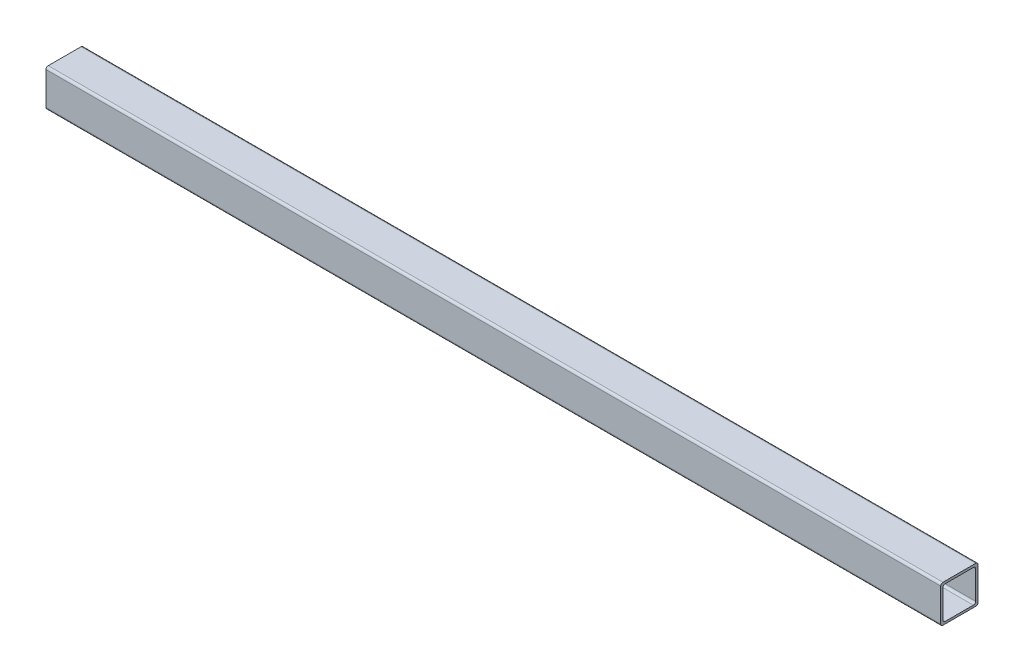
ISO-10303-21;
HEADER;
FILE_DESCRIPTION(('STEP AP214'),'2;1');
FILE_NAME('part.step','',(''),(''),'','','');
FILE_SCHEMA(('AUTOMOTIVE_DESIGN { 1 0 10303 214 1 1 1 1 }'));
ENDSEC;
DATA;
#1=APPLICATION_CONTEXT('core data for automotive mechanical design processes');
#2=APPLICATION_PROTOCOL_DEFINITION('international standard','automotive_design',2000,#1);
#3=PRODUCT_CONTEXT('',#1,'mechanical');
#4=PRODUCT('Part','Part','',(#3));
#5=PRODUCT_RELATED_PRODUCT_CATEGORY('part','',(#4));
#6=PRODUCT_DEFINITION_FORMATION('','',#4);
#7=PRODUCT_DEFINITION_CONTEXT('part definition',#1,'design');
#8=PRODUCT_DEFINITION('design','',#6,#7);
#9=PRODUCT_DEFINITION_SHAPE('','',#8);
#10=(LENGTH_UNIT() NAMED_UNIT(*) SI_UNIT(.MILLI.,.METRE.));
#11=(NAMED_UNIT(*) PLANE_ANGLE_UNIT() SI_UNIT($,.RADIAN.));
#12=(NAMED_UNIT(*) SI_UNIT($,.STERADIAN.) SOLID_ANGLE_UNIT());
#13=UNCERTAINTY_MEASURE_WITH_UNIT(LENGTH_MEASURE(1.E-05),#10,'distance_accuracy_value','');
#14=(GEOMETRIC_REPRESENTATION_CONTEXT(3) GLOBAL_UNCERTAINTY_ASSIGNED_CONTEXT((#13)) GLOBAL_UNIT_ASSIGNED_CONTEXT((#10,
#11,#12)) REPRESENTATION_CONTEXT('',''));
#15=CARTESIAN_POINT('',(0.,0.,0.));
#16=DIRECTION('',(0.,0.,1.));
#17=DIRECTION('',(1.,0.,0.));
#18=AXIS2_PLACEMENT_3D('',#15,#16,#17);
#19=CARTESIAN_POINT('',(304.8,11.938,-11.938));
#20=DIRECTION('',(-1.,0.,0.));
#21=DIRECTION('',(0.,0.,1.));
#22=AXIS2_PLACEMENT_3D('',#19,#20,#21);
#23=PLANE('',#22);
#24=CARTESIAN_POINT('',(304.8,11.938,-11.938));
#25=DIRECTION('',(1.,0.,0.));
#26=DIRECTION('',(0.,0.,1.));
#27=AXIS2_PLACEMENT_3D('',#24,#25,#26);
#28=CIRCLE('',#27,0.762000000000001);
#29=CARTESIAN_POINT('',(304.8,11.938,-12.7));
#30=VERTEX_POINT('',#29);
#31=CARTESIAN_POINT('',(304.8,12.7,-11.938));
#32=VERTEX_POINT('',#31);
#33=EDGE_CURVE('E242',#30,#32,#28,.T.);
#34=ORIENTED_EDGE('',*,*,#33,.T.);
#35=DIRECTION('',(0.,0.,1.));
#36=VECTOR('',#35,1.);
#37=CARTESIAN_POINT('',(304.8,12.7,-0.762000000000002));
#38=LINE('',#37,#36);
#39=CARTESIAN_POINT('',(304.8,12.7,-0.762000000000002));
#40=VERTEX_POINT('',#39);
#41=EDGE_CURVE('E246',#32,#40,#38,.T.);
#42=ORIENTED_EDGE('',*,*,#41,.T.);
#43=CARTESIAN_POINT('',(304.8,11.938,-0.761999999999997));
#44=DIRECTION('',(1.,0.,0.));
#45=DIRECTION('',(0.,0.,1.));
#46=AXIS2_PLACEMENT_3D('',#43,#44,#45);
#47=CIRCLE('',#46,0.762);
#48=CARTESIAN_POINT('',(304.8,11.938,0.));
#49=VERTEX_POINT('',#48);
#50=EDGE_CURVE('E250',#40,#49,#47,.T.);
#51=ORIENTED_EDGE('',*,*,#50,.T.);
#52=DIRECTION('',(0.,-1.,0.));
#53=VECTOR('',#52,1.);
#54=CARTESIAN_POINT('',(304.8,0.762000000000005,0.));
#55=LINE('',#54,#53);
#56=CARTESIAN_POINT('',(304.8,0.762000000000005,0.));
#57=VERTEX_POINT('',#56);
#58=EDGE_CURVE('E253',#49,#57,#55,.T.);
#59=ORIENTED_EDGE('',*,*,#58,.T.);
#60=CARTESIAN_POINT('',(304.8,0.762,-0.762));
#61=DIRECTION('',(1.,0.,0.));
#62=DIRECTION('',(0.,0.,1.));
#63=AXIS2_PLACEMENT_3D('',#60,#61,#62);
#64=CIRCLE('',#63,0.762);
#65=CARTESIAN_POINT('',(304.8,0.,-0.762000000000005));
#66=VERTEX_POINT('',#65);
#67=EDGE_CURVE('E256',#57,#66,#64,.T.);
#68=ORIENTED_EDGE('',*,*,#67,.T.);
#69=DIRECTION('',(0.,0.,-1.));
#70=VECTOR('',#69,1.);
#71=CARTESIAN_POINT('',(304.8,0.,-0.762000000000005));
#72=LINE('',#71,#70);
#73=CARTESIAN_POINT('',(304.8,0.,-11.938));
#74=VERTEX_POINT('',#73);
#75=EDGE_CURVE('E259',#66,#74,#72,.T.);
#76=ORIENTED_EDGE('',*,*,#75,.T.);
#77=CARTESIAN_POINT('',(304.8,0.762,-11.938));
#78=DIRECTION('',(1.,0.,0.));
#79=DIRECTION('',(0.,0.,-1.));
#80=AXIS2_PLACEMENT_3D('',#77,#78,#79);
#81=CIRCLE('',#80,0.762);
#82=CARTESIAN_POINT('',(304.8,0.762,-12.7));
#83=VERTEX_POINT('',#82);
#84=EDGE_CURVE('E262',#74,#83,#81,.T.);
#85=ORIENTED_EDGE('',*,*,#84,.T.);
#86=DIRECTION('',(0.,1.,0.));
#87=VECTOR('',#86,1.);
#88=CARTESIAN_POINT('',(304.8,0.762000000000005,-12.7));
#89=LINE('',#88,#87);
#90=EDGE_CURVE('E265',#83,#30,#89,.T.);
#91=ORIENTED_EDGE('',*,*,#90,.T.);
#92=EDGE_LOOP('',(#34,#42,#51,#59,#68,#76,#85,#91));
#93=FACE_BOUND('',#92,.T.);
#94=CARTESIAN_POINT('',(304.8,11.1125,-11.1125));
#95=DIRECTION('',(1.,0.,0.));
#96=DIRECTION('',(0.,0.,1.));
#97=AXIS2_PLACEMENT_3D('',#94,#95,#96);
#98=CIRCLE('',#97,0.762000000000001);
#99=CARTESIAN_POINT('',(304.8,11.1125,-11.8745));
#100=VERTEX_POINT('',#99);
#101=CARTESIAN_POINT('',(304.8,11.8745,-11.1125));
#102=VERTEX_POINT('',#101);
#103=EDGE_CURVE('E153',#100,#102,#98,.T.);
#104=ORIENTED_EDGE('',*,*,#103,.F.);
#105=DIRECTION('',(0.,1.,0.));
#106=VECTOR('',#105,1.);
#107=CARTESIAN_POINT('',(304.8,1.52400000000001,-11.8745));
#108=LINE('',#107,#106);
#109=CARTESIAN_POINT('',(304.8,1.524,-11.8745));
#110=VERTEX_POINT('',#109);
#111=EDGE_CURVE('E194',#110,#100,#108,.T.);
#112=ORIENTED_EDGE('',*,*,#111,.F.);
#113=CARTESIAN_POINT('',(304.8,1.524,-11.1125));
#114=DIRECTION('',(1.,0.,0.));
#115=DIRECTION('',(0.,0.,-1.));
#116=AXIS2_PLACEMENT_3D('',#113,#114,#115);
#117=CIRCLE('',#116,0.762);
#118=CARTESIAN_POINT('',(304.8,0.762,-11.1125));
#119=VERTEX_POINT('',#118);
#120=EDGE_CURVE('E191',#119,#110,#117,.T.);
#121=ORIENTED_EDGE('',*,*,#120,.F.);
#122=DIRECTION('',(0.,0.,-1.));
#123=VECTOR('',#122,1.);
#124=CARTESIAN_POINT('',(304.8,0.762,-1.52400000000001));
#125=LINE('',#124,#123);
#126=CARTESIAN_POINT('',(304.8,0.762,-1.52400000000001));
#127=VERTEX_POINT('',#126);
#128=EDGE_CURVE('E188',#127,#119,#125,.T.);
#129=ORIENTED_EDGE('',*,*,#128,.F.);
#130=CARTESIAN_POINT('',(304.8,1.524,-1.524));
#131=DIRECTION('',(1.,0.,0.));
#132=DIRECTION('',(0.,0.,1.));
#133=AXIS2_PLACEMENT_3D('',#130,#131,#132);
#134=CIRCLE('',#133,0.762);
#135=CARTESIAN_POINT('',(304.8,1.52400000000001,-0.762));
#136=VERTEX_POINT('',#135);
#137=EDGE_CURVE('E185',#136,#127,#134,.T.);
#138=ORIENTED_EDGE('',*,*,#137,.F.);
#139=DIRECTION('',(0.,-1.,0.));
#140=VECTOR('',#139,1.);
#141=CARTESIAN_POINT('',(304.8,1.52400000000001,-0.762));
#142=LINE('',#141,#140);
#143=CARTESIAN_POINT('',(304.8,11.1125,-0.762));
#144=VERTEX_POINT('',#143);
#145=EDGE_CURVE('E180',#144,#136,#142,.T.);
#146=ORIENTED_EDGE('',*,*,#145,.F.);
#147=CARTESIAN_POINT('',(304.8,11.1125,-1.524));
#148=DIRECTION('',(1.,0.,0.));
#149=DIRECTION('',(0.,0.,1.));
#150=AXIS2_PLACEMENT_3D('',#147,#148,#149);
#151=CIRCLE('',#150,0.762);
#152=CARTESIAN_POINT('',(304.8,11.8745,-1.52400000000001));
#153=VERTEX_POINT('',#152);
#154=EDGE_CURVE('E176',#153,#144,#151,.T.);
#155=ORIENTED_EDGE('',*,*,#154,.F.);
#156=DIRECTION('',(0.,0.,1.));
#157=VECTOR('',#156,1.);
#158=CARTESIAN_POINT('',(304.8,11.8745,-1.52400000000001));
#159=LINE('',#158,#157);
#160=EDGE_CURVE('E162',#102,#153,#159,.T.);
#161=ORIENTED_EDGE('',*,*,#160,.F.);
#162=EDGE_LOOP('',(#104,#112,#121,#129,#138,#146,#155,#161));
#163=FACE_BOUND('',#162,.T.);
#164=ADVANCED_FACE('F39',(#93,#163),#23,.F.);
#165=CARTESIAN_POINT('',(0.,11.938,-11.938));
#166=DIRECTION('',(-1.,0.,0.));
#167=DIRECTION('',(0.,0.,1.));
#168=AXIS2_PLACEMENT_3D('',#165,#166,#167);
#169=PLANE('',#168);
#170=CARTESIAN_POINT('',(0.,11.938,-11.938));
#171=DIRECTION('',(1.,0.,0.));
#172=DIRECTION('',(0.,0.,1.));
#173=AXIS2_PLACEMENT_3D('',#170,#171,#172);
#174=CIRCLE('',#173,0.762000000000001);
#175=CARTESIAN_POINT('',(0.,11.938,-12.7));
#176=VERTEX_POINT('',#175);
#177=CARTESIAN_POINT('',(0.,12.7,-11.938));
#178=VERTEX_POINT('',#177);
#179=EDGE_CURVE('E171',#176,#178,#174,.T.);
#180=ORIENTED_EDGE('',*,*,#179,.F.);
#181=DIRECTION('',(0.,1.,0.));
#182=VECTOR('',#181,1.);
#183=CARTESIAN_POINT('',(0.,0.762000000000005,-12.7));
#184=LINE('',#183,#182);
#185=CARTESIAN_POINT('',(0.,0.762,-12.7));
#186=VERTEX_POINT('',#185);
#187=EDGE_CURVE('E247',#186,#176,#184,.T.);
#188=ORIENTED_EDGE('',*,*,#187,.F.);
#189=CARTESIAN_POINT('',(0.,0.762,-11.938));
#190=DIRECTION('',(1.,0.,0.));
#191=DIRECTION('',(0.,0.,-1.));
#192=AXIS2_PLACEMENT_3D('',#189,#190,#191);
#193=CIRCLE('',#192,0.762);
#194=CARTESIAN_POINT('',(0.,0.,-11.938));
#195=VERTEX_POINT('',#194);
#196=EDGE_CURVE('E287',#195,#186,#193,.T.);
#197=ORIENTED_EDGE('',*,*,#196,.F.);
#198=DIRECTION('',(0.,0.,-1.));
#199=VECTOR('',#198,1.);
#200=CARTESIAN_POINT('',(0.,0.,-0.762000000000005));
#201=LINE('',#200,#199);
#202=CARTESIAN_POINT('',(0.,0.,-0.762000000000005));
#203=VERTEX_POINT('',#202);
#204=EDGE_CURVE('E284',#203,#195,#201,.T.);
#205=ORIENTED_EDGE('',*,*,#204,.F.);
#206=CARTESIAN_POINT('',(0.,0.762,-0.762));
#207=DIRECTION('',(1.,0.,0.));
#208=DIRECTION('',(0.,0.,1.));
#209=AXIS2_PLACEMENT_3D('',#206,#207,#208);
#210=CIRCLE('',#209,0.762);
#211=CARTESIAN_POINT('',(0.,0.762000000000005,0.));
#212=VERTEX_POINT('',#211);
#213=EDGE_CURVE('E281',#212,#203,#210,.T.);
#214=ORIENTED_EDGE('',*,*,#213,.F.);
#215=DIRECTION('',(0.,-1.,0.));
#216=VECTOR('',#215,1.);
#217=CARTESIAN_POINT('',(0.,0.762000000000005,0.));
#218=LINE('',#217,#216);
#219=CARTESIAN_POINT('',(0.,11.938,0.));
#220=VERTEX_POINT('',#219);
#221=EDGE_CURVE('E278',#220,#212,#218,.T.);
#222=ORIENTED_EDGE('',*,*,#221,.F.);
#223=CARTESIAN_POINT('',(0.,11.938,-0.761999999999997));
#224=DIRECTION('',(1.,0.,0.));
#225=DIRECTION('',(0.,0.,1.));
#226=AXIS2_PLACEMENT_3D('',#223,#224,#225);
#227=CIRCLE('',#226,0.762);
#228=CARTESIAN_POINT('',(0.,12.7,-0.762000000000002));
#229=VERTEX_POINT('',#228);
#230=EDGE_CURVE('E275',#229,#220,#227,.T.);
#231=ORIENTED_EDGE('',*,*,#230,.F.);
#232=DIRECTION('',(0.,0.,1.));
#233=VECTOR('',#232,1.);
#234=CARTESIAN_POINT('',(0.,12.7,-0.762000000000002));
#235=LINE('',#234,#233);
#236=EDGE_CURVE('E272',#178,#229,#235,.T.);
#237=ORIENTED_EDGE('',*,*,#236,.F.);
#238=EDGE_LOOP('',(#180,#188,#197,#205,#214,#222,#231,#237));
#239=FACE_BOUND('',#238,.T.);
#240=DIRECTION('',(0.,1.,0.));
#241=VECTOR('',#240,1.);
#242=CARTESIAN_POINT('',(0.,1.52400000000001,-11.8745));
#243=LINE('',#242,#241);
#244=CARTESIAN_POINT('',(0.,1.524,-11.8745));
#245=VERTEX_POINT('',#244);
#246=CARTESIAN_POINT('',(0.,11.1125,-11.8745));
#247=VERTEX_POINT('',#246);
#248=EDGE_CURVE('E163',#245,#247,#243,.T.);
#249=ORIENTED_EDGE('',*,*,#248,.T.);
#250=CARTESIAN_POINT('',(0.,11.1125,-11.1125));
#251=DIRECTION('',(1.,0.,0.));
#252=DIRECTION('',(0.,0.,1.));
#253=AXIS2_PLACEMENT_3D('',#250,#251,#252);
#254=CIRCLE('',#253,0.762000000000001);
#255=CARTESIAN_POINT('',(0.,11.8745,-11.1125));
#256=VERTEX_POINT('',#255);
#257=EDGE_CURVE('E63',#247,#256,#254,.T.);
#258=ORIENTED_EDGE('',*,*,#257,.T.);
#259=DIRECTION('',(0.,0.,1.));
#260=VECTOR('',#259,1.);
#261=CARTESIAN_POINT('',(0.,11.8745,-1.52400000000001));
#262=LINE('',#261,#260);
#263=CARTESIAN_POINT('',(0.,11.8745,-1.52400000000001));
#264=VERTEX_POINT('',#263);
#265=EDGE_CURVE('E169',#256,#264,#262,.T.);
#266=ORIENTED_EDGE('',*,*,#265,.T.);
#267=CARTESIAN_POINT('',(0.,11.1125,-1.524));
#268=DIRECTION('',(1.,0.,0.));
#269=DIRECTION('',(0.,0.,1.));
#270=AXIS2_PLACEMENT_3D('',#267,#268,#269);
#271=CIRCLE('',#270,0.762);
#272=CARTESIAN_POINT('',(0.,11.1125,-0.762));
#273=VERTEX_POINT('',#272);
#274=EDGE_CURVE('E201',#264,#273,#271,.T.);
#275=ORIENTED_EDGE('',*,*,#274,.T.);
#276=DIRECTION('',(0.,-1.,0.));
#277=VECTOR('',#276,1.);
#278=CARTESIAN_POINT('',(0.,1.52400000000001,-0.762));
#279=LINE('',#278,#277);
#280=CARTESIAN_POINT('',(0.,1.52400000000001,-0.762));
#281=VERTEX_POINT('',#280);
#282=EDGE_CURVE('E205',#273,#281,#279,.T.);
#283=ORIENTED_EDGE('',*,*,#282,.T.);
#284=CARTESIAN_POINT('',(0.,1.524,-1.524));
#285=DIRECTION('',(1.,0.,0.));
#286=DIRECTION('',(0.,0.,1.));
#287=AXIS2_PLACEMENT_3D('',#284,#285,#286);
#288=CIRCLE('',#287,0.762);
#289=CARTESIAN_POINT('',(0.,0.762,-1.52400000000001));
#290=VERTEX_POINT('',#289);
#291=EDGE_CURVE('E209',#281,#290,#288,.T.);
#292=ORIENTED_EDGE('',*,*,#291,.T.);
#293=DIRECTION('',(0.,0.,-1.));
#294=VECTOR('',#293,1.);
#295=CARTESIAN_POINT('',(0.,0.762,-1.52400000000001));
#296=LINE('',#295,#294);
#297=CARTESIAN_POINT('',(0.,0.762,-11.1125));
#298=VERTEX_POINT('',#297);
#299=EDGE_CURVE('E213',#290,#298,#296,.T.);
#300=ORIENTED_EDGE('',*,*,#299,.T.);
#301=CARTESIAN_POINT('',(0.,1.524,-11.1125));
#302=DIRECTION('',(1.,0.,0.));
#303=DIRECTION('',(0.,0.,-1.));
#304=AXIS2_PLACEMENT_3D('',#301,#302,#303);
#305=CIRCLE('',#304,0.762);
#306=EDGE_CURVE('E217',#298,#245,#305,.T.);
#307=ORIENTED_EDGE('',*,*,#306,.T.);
#308=EDGE_LOOP('',(#249,#258,#266,#275,#283,#292,#300,#307));
#309=FACE_BOUND('',#308,.T.);
#310=ADVANCED_FACE('F326',(#239,#309),#169,.T.);
#311=CARTESIAN_POINT('',(304.8,11.938,-11.938));
#312=DIRECTION('',(-1.,0.,0.));
#313=DIRECTION('',(0.,0.,1.));
#314=AXIS2_PLACEMENT_3D('',#311,#312,#313);
#315=CYLINDRICAL_SURFACE('',#314,0.762000000000001);
#316=ORIENTED_EDGE('',*,*,#179,.T.);
#317=DIRECTION('',(-1.,0.,0.));
#318=VECTOR('',#317,1.);
#319=CARTESIAN_POINT('',(304.8,12.7,-11.938));
#320=LINE('',#319,#318);
#321=EDGE_CURVE('E11',#32,#178,#320,.T.);
#322=ORIENTED_EDGE('',*,*,#321,.F.);
#323=ORIENTED_EDGE('',*,*,#33,.F.);
#324=DIRECTION('',(-1.,0.,0.));
#325=VECTOR('',#324,1.);
#326=CARTESIAN_POINT('',(304.8,11.938,-12.7));
#327=LINE('',#326,#325);
#328=EDGE_CURVE('E268',#30,#176,#327,.T.);
#329=ORIENTED_EDGE('',*,*,#328,.T.);
#330=EDGE_LOOP('',(#316,#322,#323,#329));
#331=FACE_BOUND('',#330,.T.);
#332=ADVANCED_FACE('F41',(#331),#315,.T.);
#333=CARTESIAN_POINT('',(304.8,12.7,-0.762000000000002));
#334=DIRECTION('',(0.,-1.,0.));
#335=DIRECTION('',(0.,0.,-1.));
#336=AXIS2_PLACEMENT_3D('',#333,#334,#335);
#337=PLANE('',#336);
#338=ORIENTED_EDGE('',*,*,#236,.T.);
#339=DIRECTION('',(-1.,0.,0.));
#340=VECTOR('',#339,1.);
#341=CARTESIAN_POINT('',(304.8,12.7,-0.762000000000002));
#342=LINE('',#341,#340);
#343=EDGE_CURVE('E48',#40,#229,#342,.T.);
#344=ORIENTED_EDGE('',*,*,#343,.F.);
#345=ORIENTED_EDGE('',*,*,#41,.F.);
#346=ORIENTED_EDGE('',*,*,#321,.T.);
#347=EDGE_LOOP('',(#338,#344,#345,#346));
#348=FACE_BOUND('',#347,.T.);
#349=ADVANCED_FACE('F343',(#348),#337,.F.);
#350=CARTESIAN_POINT('',(304.8,11.938,-0.761999999999997));
#351=DIRECTION('',(-1.,0.,0.));
#352=DIRECTION('',(0.,0.,1.));
#353=AXIS2_PLACEMENT_3D('',#350,#351,#352);
#354=CYLINDRICAL_SURFACE('',#353,0.762);
#355=ORIENTED_EDGE('',*,*,#230,.T.);
#356=DIRECTION('',(-1.,0.,0.));
#357=VECTOR('',#356,1.);
#358=CARTESIAN_POINT('',(304.8,11.938,0.));
#359=LINE('',#358,#357);
#360=EDGE_CURVE('E311',#49,#220,#359,.T.);
#361=ORIENTED_EDGE('',*,*,#360,.F.);
#362=ORIENTED_EDGE('',*,*,#50,.F.);
#363=ORIENTED_EDGE('',*,*,#343,.T.);
#364=EDGE_LOOP('',(#355,#361,#362,#363));
#365=FACE_BOUND('',#364,.T.);
#366=ADVANCED_FACE('F320',(#365),#354,.T.);
#367=CARTESIAN_POINT('',(304.8,0.762000000000005,0.));
#368=DIRECTION('',(0.,0.,-1.));
#369=DIRECTION('',(0.,1.,0.));
#370=AXIS2_PLACEMENT_3D('',#367,#368,#369);
#371=PLANE('',#370);
#372=ORIENTED_EDGE('',*,*,#221,.T.);
#373=DIRECTION('',(-1.,0.,0.));
#374=VECTOR('',#373,1.);
#375=CARTESIAN_POINT('',(304.8,0.762000000000005,0.));
#376=LINE('',#375,#374);
#377=EDGE_CURVE('E307',#57,#212,#376,.T.);
#378=ORIENTED_EDGE('',*,*,#377,.F.);
#379=ORIENTED_EDGE('',*,*,#58,.F.);
#380=ORIENTED_EDGE('',*,*,#360,.T.);
#381=EDGE_LOOP('',(#372,#378,#379,#380));
#382=FACE_BOUND('',#381,.T.);
#383=ADVANCED_FACE('F332',(#382),#371,.F.);
#384=CARTESIAN_POINT('',(304.8,0.762,-0.762));
#385=DIRECTION('',(-1.,0.,0.));
#386=DIRECTION('',(0.,0.,1.));
#387=AXIS2_PLACEMENT_3D('',#384,#385,#386);
#388=CYLINDRICAL_SURFACE('',#387,0.762);
#389=ORIENTED_EDGE('',*,*,#213,.T.);
#390=DIRECTION('',(-1.,0.,0.));
#391=VECTOR('',#390,1.);
#392=CARTESIAN_POINT('',(304.8,0.,-0.762000000000005));
#393=LINE('',#392,#391);
#394=EDGE_CURVE('E303',#66,#203,#393,.T.);
#395=ORIENTED_EDGE('',*,*,#394,.F.);
#396=ORIENTED_EDGE('',*,*,#67,.F.);
#397=ORIENTED_EDGE('',*,*,#377,.T.);
#398=EDGE_LOOP('',(#389,#395,#396,#397));
#399=FACE_BOUND('',#398,.T.);
#400=ADVANCED_FACE('F336',(#399),#388,.T.);
#401=CARTESIAN_POINT('',(304.8,0.,-0.762000000000005));
#402=DIRECTION('',(0.,1.,0.));
#403=DIRECTION('',(0.,0.,1.));
#404=AXIS2_PLACEMENT_3D('',#401,#402,#403);
#405=PLANE('',#404);
#406=ORIENTED_EDGE('',*,*,#204,.T.);
#407=DIRECTION('',(-1.,0.,0.));
#408=VECTOR('',#407,1.);
#409=CARTESIAN_POINT('',(304.8,0.,-11.938));
#410=LINE('',#409,#408);
#411=EDGE_CURVE('E299',#74,#195,#410,.T.);
#412=ORIENTED_EDGE('',*,*,#411,.F.);
#413=ORIENTED_EDGE('',*,*,#75,.F.);
#414=ORIENTED_EDGE('',*,*,#394,.T.);
#415=EDGE_LOOP('',(#406,#412,#413,#414));
#416=FACE_BOUND('',#415,.T.);
#417=ADVANCED_FACE('F356',(#416),#405,.F.);
#418=CARTESIAN_POINT('',(304.8,0.762,-11.938));
#419=DIRECTION('',(-1.,0.,0.));
#420=DIRECTION('',(0.,0.,1.));
#421=AXIS2_PLACEMENT_3D('',#418,#419,#420);
#422=CYLINDRICAL_SURFACE('',#421,0.762);
#423=ORIENTED_EDGE('',*,*,#196,.T.);
#424=DIRECTION('',(-1.,0.,0.));
#425=VECTOR('',#424,1.);
#426=CARTESIAN_POINT('',(304.8,0.762,-12.7));
#427=LINE('',#426,#425);
#428=EDGE_CURVE('E295',#83,#186,#427,.T.);
#429=ORIENTED_EDGE('',*,*,#428,.F.);
#430=ORIENTED_EDGE('',*,*,#84,.F.);
#431=ORIENTED_EDGE('',*,*,#411,.T.);
#432=EDGE_LOOP('',(#423,#429,#430,#431));
#433=FACE_BOUND('',#432,.T.);
#434=ADVANCED_FACE('F354',(#433),#422,.T.);
#435=CARTESIAN_POINT('',(304.8,0.762000000000005,-12.7));
#436=DIRECTION('',(0.,0.,1.));
#437=DIRECTION('',(0.,-1.,0.));
#438=AXIS2_PLACEMENT_3D('',#435,#436,#437);
#439=PLANE('',#438);
#440=ORIENTED_EDGE('',*,*,#187,.T.);
#441=ORIENTED_EDGE('',*,*,#328,.F.);
#442=ORIENTED_EDGE('',*,*,#90,.F.);
#443=ORIENTED_EDGE('',*,*,#428,.T.);
#444=EDGE_LOOP('',(#440,#441,#442,#443));
#445=FACE_BOUND('',#444,.T.);
#446=ADVANCED_FACE('F349',(#445),#439,.F.);
#447=CARTESIAN_POINT('',(304.8,11.1125,-11.1125));
#448=DIRECTION('',(-1.,0.,0.));
#449=DIRECTION('',(0.,0.,1.));
#450=AXIS2_PLACEMENT_3D('',#447,#448,#449);
#451=CYLINDRICAL_SURFACE('',#450,0.762000000000001);
#452=ORIENTED_EDGE('',*,*,#257,.F.);
#453=DIRECTION('',(-1.,0.,0.));
#454=VECTOR('',#453,1.);
#455=CARTESIAN_POINT('',(304.8,11.1125,-11.8745));
#456=LINE('',#455,#454);
#457=EDGE_CURVE('E157',#100,#247,#456,.T.);
#458=ORIENTED_EDGE('',*,*,#457,.F.);
#459=ORIENTED_EDGE('',*,*,#103,.T.);
#460=DIRECTION('',(-1.,0.,0.));
#461=VECTOR('',#460,1.);
#462=CARTESIAN_POINT('',(304.8,11.8745,-11.1125));
#463=LINE('',#462,#461);
#464=EDGE_CURVE('E156',#102,#256,#463,.T.);
#465=ORIENTED_EDGE('',*,*,#464,.T.);
#466=EDGE_LOOP('',(#452,#458,#459,#465));
#467=FACE_BOUND('',#466,.T.);
#468=ADVANCED_FACE('F155',(#467),#451,.F.);
#469=CARTESIAN_POINT('',(304.8,11.8745,-1.52400000000001));
#470=DIRECTION('',(0.,-1.,0.));
#471=DIRECTION('',(0.,0.,-1.));
#472=AXIS2_PLACEMENT_3D('',#469,#470,#471);
#473=PLANE('',#472);
#474=ORIENTED_EDGE('',*,*,#265,.F.);
#475=ORIENTED_EDGE('',*,*,#464,.F.);
#476=ORIENTED_EDGE('',*,*,#160,.T.);
#477=DIRECTION('',(-1.,0.,0.));
#478=VECTOR('',#477,1.);
#479=CARTESIAN_POINT('',(304.8,11.8745,-1.52400000000001));
#480=LINE('',#479,#478);
#481=EDGE_CURVE('E172',#153,#264,#480,.T.);
#482=ORIENTED_EDGE('',*,*,#481,.T.);
#483=EDGE_LOOP('',(#474,#475,#476,#482));
#484=FACE_BOUND('',#483,.T.);
#485=ADVANCED_FACE('F166',(#484),#473,.T.);
#486=CARTESIAN_POINT('',(304.8,11.1125,-1.524));
#487=DIRECTION('',(-1.,0.,0.));
#488=DIRECTION('',(0.,0.,1.));
#489=AXIS2_PLACEMENT_3D('',#486,#487,#488);
#490=CYLINDRICAL_SURFACE('',#489,0.762);
#491=ORIENTED_EDGE('',*,*,#274,.F.);
#492=ORIENTED_EDGE('',*,*,#481,.F.);
#493=ORIENTED_EDGE('',*,*,#154,.T.);
#494=DIRECTION('',(-1.,0.,0.));
#495=VECTOR('',#494,1.);
#496=CARTESIAN_POINT('',(304.8,11.1125,-0.762));
#497=LINE('',#496,#495);
#498=EDGE_CURVE('E237',#144,#273,#497,.T.);
#499=ORIENTED_EDGE('',*,*,#498,.T.);
#500=EDGE_LOOP('',(#491,#492,#493,#499));
#501=FACE_BOUND('',#500,.T.);
#502=ADVANCED_FACE('F381',(#501),#490,.F.);
#503=CARTESIAN_POINT('',(304.8,1.52400000000001,-0.762));
#504=DIRECTION('',(0.,0.,-1.));
#505=DIRECTION('',(-1.,0.,0.));
#506=AXIS2_PLACEMENT_3D('',#503,#504,#505);
#507=PLANE('',#506);
#508=ORIENTED_EDGE('',*,*,#282,.F.);
#509=ORIENTED_EDGE('',*,*,#498,.F.);
#510=ORIENTED_EDGE('',*,*,#145,.T.);
#511=DIRECTION('',(-1.,0.,0.));
#512=VECTOR('',#511,1.);
#513=CARTESIAN_POINT('',(304.8,1.52400000000001,-0.762));
#514=LINE('',#513,#512);
#515=EDGE_CURVE('E234',#136,#281,#514,.T.);
#516=ORIENTED_EDGE('',*,*,#515,.T.);
#517=EDGE_LOOP('',(#508,#509,#510,#516));
#518=FACE_BOUND('',#517,.T.);
#519=ADVANCED_FACE('F385',(#518),#507,.T.);
#520=CARTESIAN_POINT('',(304.8,1.524,-1.524));
#521=DIRECTION('',(-1.,0.,0.));
#522=DIRECTION('',(0.,0.,1.));
#523=AXIS2_PLACEMENT_3D('',#520,#521,#522);
#524=CYLINDRICAL_SURFACE('',#523,0.762);
#525=ORIENTED_EDGE('',*,*,#291,.F.);
#526=ORIENTED_EDGE('',*,*,#515,.F.);
#527=ORIENTED_EDGE('',*,*,#137,.T.);
#528=DIRECTION('',(-1.,0.,0.));
#529=VECTOR('',#528,1.);
#530=CARTESIAN_POINT('',(304.8,0.762,-1.52400000000001));
#531=LINE('',#530,#529);
#532=EDGE_CURVE('E231',#127,#290,#531,.T.);
#533=ORIENTED_EDGE('',*,*,#532,.T.);
#534=EDGE_LOOP('',(#525,#526,#527,#533));
#535=FACE_BOUND('',#534,.T.);
#536=ADVANCED_FACE('F391',(#535),#524,.F.);
#537=CARTESIAN_POINT('',(304.8,0.762,-1.52400000000001));
#538=DIRECTION('',(0.,1.,0.));
#539=DIRECTION('',(0.,0.,1.));
#540=AXIS2_PLACEMENT_3D('',#537,#538,#539);
#541=PLANE('',#540);
#542=ORIENTED_EDGE('',*,*,#299,.F.);
#543=ORIENTED_EDGE('',*,*,#532,.F.);
#544=ORIENTED_EDGE('',*,*,#128,.T.);
#545=DIRECTION('',(-1.,0.,0.));
#546=VECTOR('',#545,1.);
#547=CARTESIAN_POINT('',(304.8,0.762,-11.1125));
#548=LINE('',#547,#546);
#549=EDGE_CURVE('E228',#119,#298,#548,.T.);
#550=ORIENTED_EDGE('',*,*,#549,.T.);
#551=EDGE_LOOP('',(#542,#543,#544,#550));
#552=FACE_BOUND('',#551,.T.);
#553=ADVANCED_FACE('F395',(#552),#541,.T.);
#554=CARTESIAN_POINT('',(304.8,1.524,-11.1125));
#555=DIRECTION('',(-1.,0.,0.));
#556=DIRECTION('',(0.,0.,1.));
#557=AXIS2_PLACEMENT_3D('',#554,#555,#556);
#558=CYLINDRICAL_SURFACE('',#557,0.762);
#559=ORIENTED_EDGE('',*,*,#306,.F.);
#560=ORIENTED_EDGE('',*,*,#549,.F.);
#561=ORIENTED_EDGE('',*,*,#120,.T.);
#562=DIRECTION('',(-1.,0.,0.));
#563=VECTOR('',#562,1.);
#564=CARTESIAN_POINT('',(304.8,1.524,-11.8745));
#565=LINE('',#564,#563);
#566=EDGE_CURVE('E55',#110,#245,#565,.T.);
#567=ORIENTED_EDGE('',*,*,#566,.T.);
#568=EDGE_LOOP('',(#559,#560,#561,#567));
#569=FACE_BOUND('',#568,.T.);
#570=ADVANCED_FACE('F399',(#569),#558,.F.);
#571=CARTESIAN_POINT('',(304.8,1.52400000000001,-11.8745));
#572=DIRECTION('',(0.,0.,1.));
#573=DIRECTION('',(0.,-1.,0.));
#574=AXIS2_PLACEMENT_3D('',#571,#572,#573);
#575=PLANE('',#574);
#576=ORIENTED_EDGE('',*,*,#248,.F.);
#577=ORIENTED_EDGE('',*,*,#566,.F.);
#578=ORIENTED_EDGE('',*,*,#111,.T.);
#579=ORIENTED_EDGE('',*,*,#457,.T.);
#580=EDGE_LOOP('',(#576,#577,#578,#579));
#581=FACE_BOUND('',#580,.T.);
#582=ADVANCED_FACE('F403',(#581),#575,.T.);
#583=CLOSED_SHELL('',(#164,#310,#332,#349,#366,#383,#400,#417,#434,#446,#468,#485,#502,#519,
#536,#553,#570,#582));
#584=MANIFOLD_SOLID_BREP('B2',#583);
#585=ADVANCED_BREP_SHAPE_REPRESENTATION('',(#18,#584),#14);
#586=SHAPE_DEFINITION_REPRESENTATION(#9,#585);
ENDSEC;
END-ISO-10303-21;
